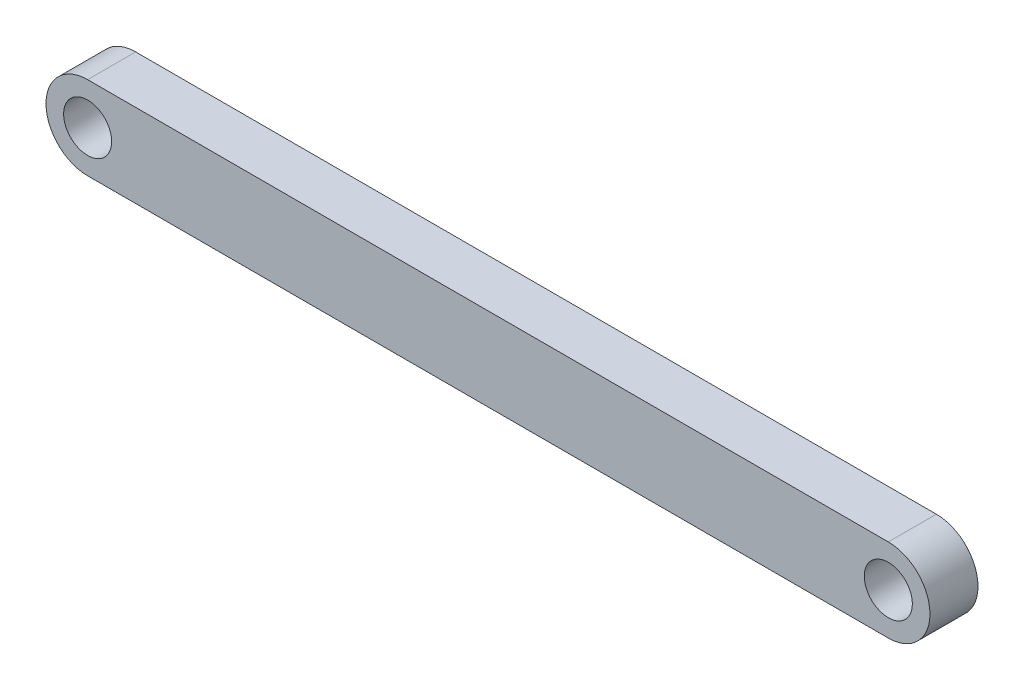
ISO-10303-21;
HEADER;
FILE_DESCRIPTION(('STEP AP214'),'2;1');
FILE_NAME('part.step','',(''),(''),'','','');
FILE_SCHEMA(('AUTOMOTIVE_DESIGN { 1 0 10303 214 1 1 1 1 }'));
ENDSEC;
DATA;
#1=APPLICATION_CONTEXT('core data for automotive mechanical design processes');
#2=APPLICATION_PROTOCOL_DEFINITION('international standard','automotive_design',2000,#1);
#3=PRODUCT_CONTEXT('',#1,'mechanical');
#4=PRODUCT('Part','Part','',(#3));
#5=PRODUCT_RELATED_PRODUCT_CATEGORY('part','',(#4));
#6=PRODUCT_DEFINITION_FORMATION('','',#4);
#7=PRODUCT_DEFINITION_CONTEXT('part definition',#1,'design');
#8=PRODUCT_DEFINITION('design','',#6,#7);
#9=PRODUCT_DEFINITION_SHAPE('','',#8);
#10=(LENGTH_UNIT() NAMED_UNIT(*) SI_UNIT(.MILLI.,.METRE.));
#11=(NAMED_UNIT(*) PLANE_ANGLE_UNIT() SI_UNIT($,.RADIAN.));
#12=(NAMED_UNIT(*) SI_UNIT($,.STERADIAN.) SOLID_ANGLE_UNIT());
#13=UNCERTAINTY_MEASURE_WITH_UNIT(LENGTH_MEASURE(1.E-05),#10,'distance_accuracy_value','');
#14=(GEOMETRIC_REPRESENTATION_CONTEXT(3) GLOBAL_UNCERTAINTY_ASSIGNED_CONTEXT((#13)) GLOBAL_UNIT_ASSIGNED_CONTEXT((#10,
#11,#12)) REPRESENTATION_CONTEXT('',''));
#15=CARTESIAN_POINT('',(0.,0.,0.));
#16=DIRECTION('',(0.,0.,1.));
#17=DIRECTION('',(1.,0.,0.));
#18=AXIS2_PLACEMENT_3D('',#15,#16,#17);
#19=CARTESIAN_POINT('',(0.,-13.,-15.));
#20=DIRECTION('',(0.,-1.,0.));
#21=DIRECTION('',(1.,0.,0.));
#22=AXIS2_PLACEMENT_3D('',#19,#20,#21);
#23=PLANE('',#22);
#24=DIRECTION('',(1.,0.,0.));
#25=VECTOR('',#24,1.);
#26=CARTESIAN_POINT('',(0.,-13.,0.));
#27=LINE('',#26,#25);
#28=CARTESIAN_POINT('',(-125.,-13.,0.));
#29=VERTEX_POINT('',#28);
#30=CARTESIAN_POINT('',(125.,-13.,0.));
#31=VERTEX_POINT('',#30);
#32=EDGE_CURVE('E110',#29,#31,#27,.T.);
#33=ORIENTED_EDGE('',*,*,#32,.F.);
#34=DIRECTION('',(0.,0.,1.));
#35=VECTOR('',#34,1.);
#36=CARTESIAN_POINT('',(-125.,-13.,-15.));
#37=LINE('',#36,#35);
#38=CARTESIAN_POINT('',(-125.,-13.,-15.));
#39=VERTEX_POINT('',#38);
#40=EDGE_CURVE('E11',#39,#29,#37,.T.);
#41=ORIENTED_EDGE('',*,*,#40,.F.);
#42=DIRECTION('',(1.,0.,0.));
#43=VECTOR('',#42,1.);
#44=CARTESIAN_POINT('',(0.,-13.,-15.));
#45=LINE('',#44,#43);
#46=CARTESIAN_POINT('',(125.,-13.,-15.));
#47=VERTEX_POINT('',#46);
#48=EDGE_CURVE('E97',#39,#47,#45,.T.);
#49=ORIENTED_EDGE('',*,*,#48,.T.);
#50=DIRECTION('',(0.,0.,1.));
#51=VECTOR('',#50,1.);
#52=CARTESIAN_POINT('',(125.,-13.,-15.));
#53=LINE('',#52,#51);
#54=EDGE_CURVE('E42',#47,#31,#53,.T.);
#55=ORIENTED_EDGE('',*,*,#54,.T.);
#56=EDGE_LOOP('',(#33,#41,#49,#55));
#57=FACE_BOUND('',#56,.T.);
#58=ADVANCED_FACE('F38',(#57),#23,.T.);
#59=CARTESIAN_POINT('',(-125.,0.,-15.));
#60=DIRECTION('',(0.,0.,1.));
#61=DIRECTION('',(1.,0.,0.));
#62=AXIS2_PLACEMENT_3D('',#59,#60,#61);
#63=CYLINDRICAL_SURFACE('',#62,13.);
#64=CARTESIAN_POINT('',(-125.,0.,0.));
#65=DIRECTION('',(0.,0.,1.));
#66=DIRECTION('',(1.,0.,0.));
#67=AXIS2_PLACEMENT_3D('',#64,#65,#66);
#68=CIRCLE('',#67,13.);
#69=CARTESIAN_POINT('',(-125.,13.,0.));
#70=VERTEX_POINT('',#69);
#71=EDGE_CURVE('E116',#70,#29,#68,.T.);
#72=ORIENTED_EDGE('',*,*,#71,.F.);
#73=DIRECTION('',(0.,0.,1.));
#74=VECTOR('',#73,1.);
#75=CARTESIAN_POINT('',(-125.,13.,-15.));
#76=LINE('',#75,#74);
#77=CARTESIAN_POINT('',(-125.,13.,-15.));
#78=VERTEX_POINT('',#77);
#79=EDGE_CURVE('E48',#78,#70,#76,.T.);
#80=ORIENTED_EDGE('',*,*,#79,.F.);
#81=CARTESIAN_POINT('',(-125.,0.,-15.));
#82=DIRECTION('',(0.,0.,1.));
#83=DIRECTION('',(1.,0.,0.));
#84=AXIS2_PLACEMENT_3D('',#81,#82,#83);
#85=CIRCLE('',#84,13.);
#86=EDGE_CURVE('E90',#78,#39,#85,.T.);
#87=ORIENTED_EDGE('',*,*,#86,.T.);
#88=ORIENTED_EDGE('',*,*,#40,.T.);
#89=EDGE_LOOP('',(#72,#80,#87,#88));
#90=FACE_BOUND('',#89,.T.);
#91=ADVANCED_FACE('F138',(#90),#63,.T.);
#92=CARTESIAN_POINT('',(0.,13.,-15.));
#93=DIRECTION('',(0.,-1.,0.));
#94=DIRECTION('',(1.,0.,0.));
#95=AXIS2_PLACEMENT_3D('',#92,#93,#94);
#96=PLANE('',#95);
#97=DIRECTION('',(1.,0.,0.));
#98=VECTOR('',#97,1.);
#99=CARTESIAN_POINT('',(0.,13.,0.));
#100=LINE('',#99,#98);
#101=CARTESIAN_POINT('',(125.,13.,0.));
#102=VERTEX_POINT('',#101);
#103=EDGE_CURVE('E94',#70,#102,#100,.T.);
#104=ORIENTED_EDGE('',*,*,#103,.T.);
#105=DIRECTION('',(0.,0.,1.));
#106=VECTOR('',#105,1.);
#107=CARTESIAN_POINT('',(125.,13.,-15.));
#108=LINE('',#107,#106);
#109=CARTESIAN_POINT('',(125.,13.,-15.));
#110=VERTEX_POINT('',#109);
#111=EDGE_CURVE('E92',#110,#102,#108,.T.);
#112=ORIENTED_EDGE('',*,*,#111,.F.);
#113=DIRECTION('',(1.,0.,0.));
#114=VECTOR('',#113,1.);
#115=CARTESIAN_POINT('',(0.,13.,-15.));
#116=LINE('',#115,#114);
#117=EDGE_CURVE('E86',#78,#110,#116,.T.);
#118=ORIENTED_EDGE('',*,*,#117,.F.);
#119=ORIENTED_EDGE('',*,*,#79,.T.);
#120=EDGE_LOOP('',(#104,#112,#118,#119));
#121=FACE_BOUND('',#120,.T.);
#122=ADVANCED_FACE('F93',(#121),#96,.F.);
#123=CARTESIAN_POINT('',(-125.,0.,-15.));
#124=DIRECTION('',(0.,0.,1.));
#125=DIRECTION('',(1.,0.,0.));
#126=AXIS2_PLACEMENT_3D('',#123,#124,#125);
#127=CYLINDRICAL_SURFACE('',#126,7.50000000000001);
#128=CARTESIAN_POINT('',(-125.,0.,-15.));
#129=DIRECTION('',(0.,0.,1.));
#130=DIRECTION('',(1.,0.,0.));
#131=AXIS2_PLACEMENT_3D('',#128,#129,#130);
#132=CIRCLE('',#131,7.50000000000001);
#133=CARTESIAN_POINT('',(-117.5,0.,-15.));
#134=VERTEX_POINT('',#133);
#135=EDGE_CURVE('E99',#134,#134,#132,.T.);
#136=ORIENTED_EDGE('',*,*,#135,.F.);
#137=EDGE_LOOP('',(#136));
#138=FACE_BOUND('',#137,.T.);
#139=CARTESIAN_POINT('',(-125.,0.,0.));
#140=DIRECTION('',(0.,0.,1.));
#141=DIRECTION('',(1.,0.,0.));
#142=AXIS2_PLACEMENT_3D('',#139,#140,#141);
#143=CIRCLE('',#142,7.50000000000001);
#144=CARTESIAN_POINT('',(-117.5,0.,0.));
#145=VERTEX_POINT('',#144);
#146=EDGE_CURVE('E107',#145,#145,#143,.T.);
#147=ORIENTED_EDGE('',*,*,#146,.T.);
#148=EDGE_LOOP('',(#147));
#149=FACE_BOUND('',#148,.T.);
#150=ADVANCED_FACE('F129',(#138,#149),#127,.F.);
#151=CARTESIAN_POINT('',(125.,0.,-15.));
#152=DIRECTION('',(0.,0.,1.));
#153=DIRECTION('',(1.,0.,0.));
#154=AXIS2_PLACEMENT_3D('',#151,#152,#153);
#155=CYLINDRICAL_SURFACE('',#154,7.50000000000001);
#156=CARTESIAN_POINT('',(125.,0.,-15.));
#157=DIRECTION('',(0.,0.,1.));
#158=DIRECTION('',(1.,0.,0.));
#159=AXIS2_PLACEMENT_3D('',#156,#157,#158);
#160=CIRCLE('',#159,7.50000000000001);
#161=CARTESIAN_POINT('',(132.5,0.,-15.));
#162=VERTEX_POINT('',#161);
#163=EDGE_CURVE('E118',#162,#162,#160,.T.);
#164=ORIENTED_EDGE('',*,*,#163,.F.);
#165=EDGE_LOOP('',(#164));
#166=FACE_BOUND('',#165,.T.);
#167=CARTESIAN_POINT('',(125.,0.,0.));
#168=DIRECTION('',(0.,0.,1.));
#169=DIRECTION('',(1.,0.,0.));
#170=AXIS2_PLACEMENT_3D('',#167,#168,#169);
#171=CIRCLE('',#170,7.50000000000001);
#172=CARTESIAN_POINT('',(132.5,0.,0.));
#173=VERTEX_POINT('',#172);
#174=EDGE_CURVE('E104',#173,#173,#171,.T.);
#175=ORIENTED_EDGE('',*,*,#174,.T.);
#176=EDGE_LOOP('',(#175));
#177=FACE_BOUND('',#176,.T.);
#178=ADVANCED_FACE('F40',(#166,#177),#155,.F.);
#179=CARTESIAN_POINT('',(125.,0.,-15.));
#180=DIRECTION('',(0.,0.,1.));
#181=DIRECTION('',(1.,0.,0.));
#182=AXIS2_PLACEMENT_3D('',#179,#180,#181);
#183=CYLINDRICAL_SURFACE('',#182,13.);
#184=CARTESIAN_POINT('',(125.,0.,0.));
#185=DIRECTION('',(0.,0.,1.));
#186=DIRECTION('',(1.,0.,0.));
#187=AXIS2_PLACEMENT_3D('',#184,#185,#186);
#188=CIRCLE('',#187,13.);
#189=EDGE_CURVE('E113',#31,#102,#188,.T.);
#190=ORIENTED_EDGE('',*,*,#189,.F.);
#191=ORIENTED_EDGE('',*,*,#54,.F.);
#192=CARTESIAN_POINT('',(125.,0.,-15.));
#193=DIRECTION('',(0.,0.,1.));
#194=DIRECTION('',(1.,0.,0.));
#195=AXIS2_PLACEMENT_3D('',#192,#193,#194);
#196=CIRCLE('',#195,13.);
#197=EDGE_CURVE('E89',#47,#110,#196,.T.);
#198=ORIENTED_EDGE('',*,*,#197,.T.);
#199=ORIENTED_EDGE('',*,*,#111,.T.);
#200=EDGE_LOOP('',(#190,#191,#198,#199));
#201=FACE_BOUND('',#200,.T.);
#202=ADVANCED_FACE('F96',(#201),#183,.T.);
#203=CARTESIAN_POINT('',(0.,0.,-15.));
#204=DIRECTION('',(0.,0.,1.));
#205=DIRECTION('',(1.,0.,0.));
#206=AXIS2_PLACEMENT_3D('',#203,#204,#205);
#207=PLANE('',#206);
#208=ORIENTED_EDGE('',*,*,#163,.T.);
#209=EDGE_LOOP('',(#208));
#210=FACE_BOUND('',#209,.T.);
#211=ORIENTED_EDGE('',*,*,#135,.T.);
#212=EDGE_LOOP('',(#211));
#213=FACE_BOUND('',#212,.T.);
#214=ORIENTED_EDGE('',*,*,#48,.F.);
#215=ORIENTED_EDGE('',*,*,#86,.F.);
#216=ORIENTED_EDGE('',*,*,#117,.T.);
#217=ORIENTED_EDGE('',*,*,#197,.F.);
#218=EDGE_LOOP('',(#214,#215,#216,#217));
#219=FACE_BOUND('',#218,.T.);
#220=ADVANCED_FACE('F88',(#210,#213,#219),#207,.F.);
#221=CARTESIAN_POINT('',(0.,0.,0.));
#222=DIRECTION('',(0.,0.,1.));
#223=DIRECTION('',(1.,0.,0.));
#224=AXIS2_PLACEMENT_3D('',#221,#222,#223);
#225=PLANE('',#224);
#226=ORIENTED_EDGE('',*,*,#174,.F.);
#227=EDGE_LOOP('',(#226));
#228=FACE_BOUND('',#227,.T.);
#229=ORIENTED_EDGE('',*,*,#146,.F.);
#230=EDGE_LOOP('',(#229));
#231=FACE_BOUND('',#230,.T.);
#232=ORIENTED_EDGE('',*,*,#32,.T.);
#233=ORIENTED_EDGE('',*,*,#189,.T.);
#234=ORIENTED_EDGE('',*,*,#103,.F.);
#235=ORIENTED_EDGE('',*,*,#71,.T.);
#236=EDGE_LOOP('',(#232,#233,#234,#235));
#237=FACE_BOUND('',#236,.T.);
#238=ADVANCED_FACE('F134',(#228,#231,#237),#225,.T.);
#239=CLOSED_SHELL('',(#58,#91,#122,#150,#178,#202,#220,#238));
#240=MANIFOLD_SOLID_BREP('B2',#239);
#241=ADVANCED_BREP_SHAPE_REPRESENTATION('',(#18,#240),#14);
#242=SHAPE_DEFINITION_REPRESENTATION(#9,#241);
ENDSEC;
END-ISO-10303-21;
